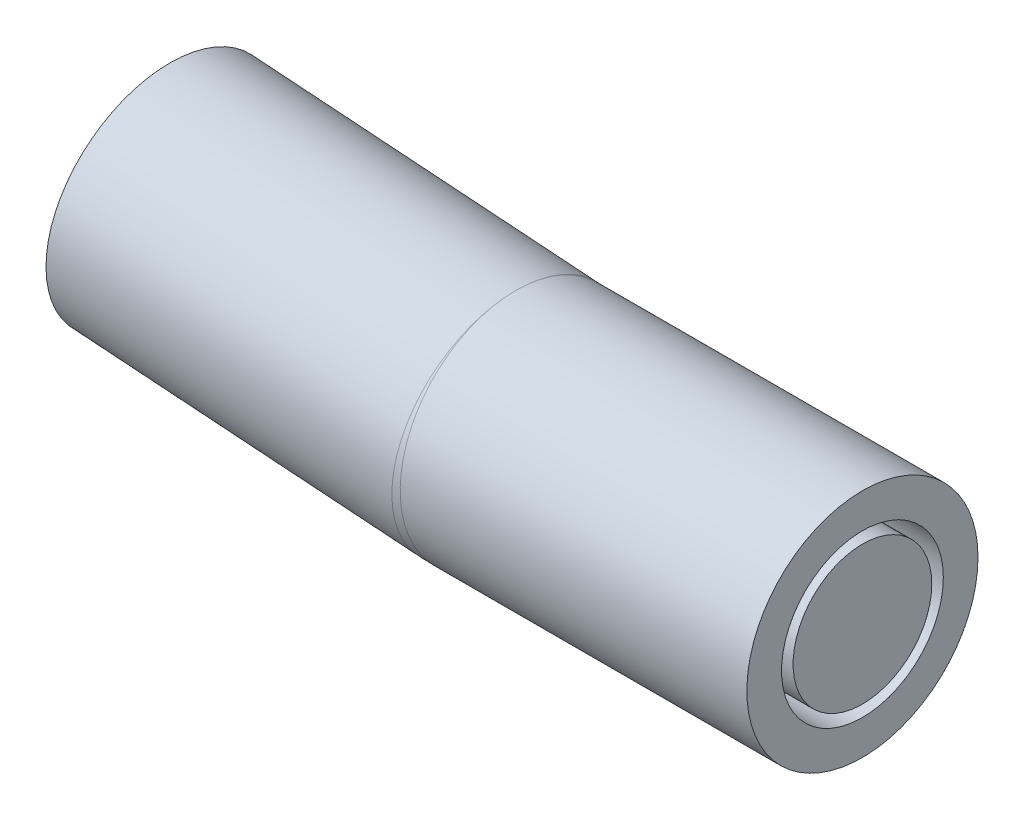
ISO-10303-21;
HEADER;
FILE_DESCRIPTION(('STEP AP214'),'2;1');
FILE_NAME('part.step','',(''),(''),'','','');
FILE_SCHEMA(('AUTOMOTIVE_DESIGN { 1 0 10303 214 1 1 1 1 }'));
ENDSEC;
DATA;
#1=APPLICATION_CONTEXT('core data for automotive mechanical design processes');
#2=APPLICATION_PROTOCOL_DEFINITION('international standard','automotive_design',2000,#1);
#3=PRODUCT_CONTEXT('',#1,'mechanical');
#4=PRODUCT('Part','Part','',(#3));
#5=PRODUCT_RELATED_PRODUCT_CATEGORY('part','',(#4));
#6=PRODUCT_DEFINITION_FORMATION('','',#4);
#7=PRODUCT_DEFINITION_CONTEXT('part definition',#1,'design');
#8=PRODUCT_DEFINITION('design','',#6,#7);
#9=PRODUCT_DEFINITION_SHAPE('','',#8);
#10=(LENGTH_UNIT() NAMED_UNIT(*) SI_UNIT(.MILLI.,.METRE.));
#11=(NAMED_UNIT(*) PLANE_ANGLE_UNIT() SI_UNIT($,.RADIAN.));
#12=(NAMED_UNIT(*) SI_UNIT($,.STERADIAN.) SOLID_ANGLE_UNIT());
#13=UNCERTAINTY_MEASURE_WITH_UNIT(LENGTH_MEASURE(1.E-05),#10,'distance_accuracy_value','');
#14=(GEOMETRIC_REPRESENTATION_CONTEXT(3) GLOBAL_UNCERTAINTY_ASSIGNED_CONTEXT((#13)) GLOBAL_UNIT_ASSIGNED_CONTEXT((#10,
#11,#12)) REPRESENTATION_CONTEXT('',''));
#15=CARTESIAN_POINT('',(0.,0.,0.));
#16=DIRECTION('',(0.,0.,1.));
#17=DIRECTION('',(1.,0.,0.));
#18=AXIS2_PLACEMENT_3D('',#15,#16,#17);
#19=CARTESIAN_POINT('',(30.,0.,0.));
#20=DIRECTION('',(-1.,0.,0.));
#21=DIRECTION('',(0.,0.,1.));
#22=AXIS2_PLACEMENT_3D('',#19,#20,#21);
#23=CYLINDRICAL_SURFACE('',#22,10.);
#24=CARTESIAN_POINT('',(30.,0.,0.));
#25=DIRECTION('',(1.,0.,0.));
#26=DIRECTION('',(0.,0.,-1.));
#27=AXIS2_PLACEMENT_3D('',#24,#25,#26);
#28=CIRCLE('',#27,10.);
#29=CARTESIAN_POINT('',(30.,0.,-10.));
#30=VERTEX_POINT('',#29);
#31=EDGE_CURVE('E11',#30,#30,#28,.T.);
#32=ORIENTED_EDGE('',*,*,#31,.F.);
#33=EDGE_LOOP('',(#32));
#34=FACE_BOUND('',#33,.T.);
#35=CARTESIAN_POINT('',(0.,0.,0.));
#36=DIRECTION('',(1.,0.,0.));
#37=DIRECTION('',(0.,0.,-1.));
#38=AXIS2_PLACEMENT_3D('',#35,#36,#37);
#39=CIRCLE('',#38,10.);
#40=CARTESIAN_POINT('',(0.,10.,0.));
#41=VERTEX_POINT('',#40);
#42=EDGE_CURVE('E47',#41,#41,#39,.T.);
#43=ORIENTED_EDGE('',*,*,#42,.T.);
#44=EDGE_LOOP('',(#43));
#45=FACE_BOUND('',#44,.T.);
#46=ADVANCED_FACE('F39',(#34,#45),#23,.T.);
#47=CARTESIAN_POINT('',(30.,0.,0.));
#48=DIRECTION('',(1.,0.,0.));
#49=DIRECTION('',(0.,0.,-1.));
#50=AXIS2_PLACEMENT_3D('',#47,#48,#49);
#51=PLANE('',#50);
#52=CARTESIAN_POINT('',(30.,0.,0.));
#53=DIRECTION('',(1.,0.,0.));
#54=DIRECTION('',(0.,0.,-1.));
#55=AXIS2_PLACEMENT_3D('',#52,#53,#54);
#56=CIRCLE('',#55,7.);
#57=CARTESIAN_POINT('',(30.,0.,-7.));
#58=VERTEX_POINT('',#57);
#59=EDGE_CURVE('E74',#58,#58,#56,.T.);
#60=ORIENTED_EDGE('',*,*,#59,.F.);
#61=EDGE_LOOP('',(#60));
#62=FACE_BOUND('',#61,.T.);
#63=ORIENTED_EDGE('',*,*,#31,.T.);
#64=EDGE_LOOP('',(#63));
#65=FACE_BOUND('',#64,.T.);
#66=ADVANCED_FACE('F98',(#62,#65),#51,.T.);
#67=CARTESIAN_POINT('',(2.,0.,0.));
#68=DIRECTION('',(1.,0.,0.));
#69=DIRECTION('',(0.,0.,-1.));
#70=AXIS2_PLACEMENT_3D('',#67,#68,#69);
#71=CYLINDRICAL_SURFACE('',#70,7.);
#72=CARTESIAN_POINT('',(2.,0.,0.));
#73=DIRECTION('',(1.,0.,0.));
#74=DIRECTION('',(0.,0.,-1.));
#75=AXIS2_PLACEMENT_3D('',#72,#73,#74);
#76=CIRCLE('',#75,7.);
#77=CARTESIAN_POINT('',(2.,0.,-7.));
#78=VERTEX_POINT('',#77);
#79=EDGE_CURVE('E76',#78,#78,#76,.T.);
#80=ORIENTED_EDGE('',*,*,#79,.F.);
#81=EDGE_LOOP('',(#80));
#82=FACE_BOUND('',#81,.T.);
#83=ORIENTED_EDGE('',*,*,#59,.T.);
#84=EDGE_LOOP('',(#83));
#85=FACE_BOUND('',#84,.T.);
#86=ADVANCED_FACE('F105',(#82,#85),#71,.F.);
#87=CARTESIAN_POINT('',(2.,0.,0.));
#88=DIRECTION('',(1.,0.,0.));
#89=DIRECTION('',(0.,0.,-1.));
#90=AXIS2_PLACEMENT_3D('',#87,#88,#89);
#91=PLANE('',#90);
#92=CARTESIAN_POINT('',(2.,0.,0.));
#93=DIRECTION('',(1.,0.,0.));
#94=DIRECTION('',(0.,0.,-1.));
#95=AXIS2_PLACEMENT_3D('',#92,#93,#94);
#96=CIRCLE('',#95,6.);
#97=CARTESIAN_POINT('',(2.,0.,-6.));
#98=VERTEX_POINT('',#97);
#99=EDGE_CURVE('E63',#98,#98,#96,.T.);
#100=ORIENTED_EDGE('',*,*,#99,.F.);
#101=EDGE_LOOP('',(#100));
#102=FACE_BOUND('',#101,.T.);
#103=ORIENTED_EDGE('',*,*,#79,.T.);
#104=EDGE_LOOP('',(#103));
#105=FACE_BOUND('',#104,.T.);
#106=ADVANCED_FACE('F112',(#102,#105),#91,.T.);
#107=CARTESIAN_POINT('',(2.,0.,0.));
#108=DIRECTION('',(1.,0.,0.));
#109=DIRECTION('',(0.,0.,-1.));
#110=AXIS2_PLACEMENT_3D('',#107,#108,#109);
#111=CYLINDRICAL_SURFACE('',#110,6.);
#112=ORIENTED_EDGE('',*,*,#99,.T.);
#113=EDGE_LOOP('',(#112));
#114=FACE_BOUND('',#113,.T.);
#115=CARTESIAN_POINT('',(30.,0.,0.));
#116=DIRECTION('',(1.,0.,0.));
#117=DIRECTION('',(0.,0.,-1.));
#118=AXIS2_PLACEMENT_3D('',#115,#116,#117);
#119=CIRCLE('',#118,6.);
#120=CARTESIAN_POINT('',(30.,0.,-6.));
#121=VERTEX_POINT('',#120);
#122=EDGE_CURVE('E57',#121,#121,#119,.T.);
#123=ORIENTED_EDGE('',*,*,#122,.F.);
#124=EDGE_LOOP('',(#123));
#125=FACE_BOUND('',#124,.T.);
#126=ADVANCED_FACE('F96',(#114,#125),#111,.T.);
#127=ORIENTED_EDGE('',*,*,#122,.T.);
#128=EDGE_LOOP('',(#127));
#129=FACE_BOUND('',#128,.T.);
#130=ADVANCED_FACE('F87',(#129),#51,.T.);
#131=CARTESIAN_POINT('',(-10.,10.,0.));
#132=DIRECTION('',(0.,-1.,0.));
#133=DIRECTION('',(-1.,0.,0.));
#134=AXIS2_PLACEMENT_3D('',#131,#132,#133);
#135=CIRCLE('',#134,10.);
#136=TRIMMED_CURVE('',#135,(PARAMETER_VALUE(-3.14159262026978)),
(PARAMETER_VALUE(3.14159262026978)),.T.,.PARAMETER.);
#137=CARTESIAN_POINT('',(0.,10.,0.));
#138=DIRECTION('',(0.,0.,-1.));
#139=AXIS1_PLACEMENT('',#137,#138);
#140=SURFACE_OF_REVOLUTION('',#136,#139);
#141=CARTESIAN_POINT('',(-0.69756473744125,0.0243594974017566,0.));
#142=DIRECTION('',(0.997564050259824,-0.069756473744125,0.));
#143=DIRECTION('',(0.069756473744125,0.997564050259824,0.));
#144=AXIS2_PLACEMENT_3D('',#141,#142,#143);
#145=CIRCLE('',#144,10.);
#146=EDGE_CURVE('E52',#41,#41,#145,.T.);
#147=ORIENTED_EDGE('',*,*,#146,.T.);
#148=ORIENTED_EDGE('',*,*,#42,.F.);
#149=EDGE_LOOP('',(#147,#148));
#150=FACE_BOUND('',#149,.T.);
#151=ADVANCED_FACE('F85',(#150),#140,.T.);
#152=CARTESIAN_POINT('',(-0.697564737441253,0.0243594974017568,0.));
#153=DIRECTION('',(0.997564050259824,-0.069756473744125,0.));
#154=DIRECTION('',(0.069756473744125,0.997564050259824,0.));
#155=AXIS2_PLACEMENT_3D('',#152,#153,#154);
#156=CYLINDRICAL_SURFACE('',#155,10.);
#157=CARTESIAN_POINT('',(-30.624486245236,2.11705370972551,0.));
#158=DIRECTION('',(0.997564050259824,-0.069756473744125,0.));
#159=DIRECTION('',(0.069756473744125,0.997564050259824,0.));
#160=AXIS2_PLACEMENT_3D('',#157,#158,#159);
#161=CIRCLE('',#160,10.);
#162=CARTESIAN_POINT('',(-29.9269215077947,12.0926942123238,0.));
#163=VERTEX_POINT('',#162);
#164=EDGE_CURVE('E58',#163,#163,#161,.T.);
#165=ORIENTED_EDGE('',*,*,#164,.T.);
#166=EDGE_LOOP('',(#165));
#167=FACE_BOUND('',#166,.T.);
#168=ORIENTED_EDGE('',*,*,#146,.F.);
#169=EDGE_LOOP('',(#168));
#170=FACE_BOUND('',#169,.T.);
#171=ADVANCED_FACE('F53',(#167,#170),#156,.T.);
#172=CARTESIAN_POINT('',(-30.624486245236,2.11705370972551,0.));
#173=DIRECTION('',(-0.997564050259824,0.069756473744125,0.));
#174=DIRECTION('',(-0.069756473744125,-0.997564050259824,0.));
#175=AXIS2_PLACEMENT_3D('',#172,#173,#174);
#176=PLANE('',#175);
#177=CARTESIAN_POINT('',(-30.6227870125951,2.1413538686159,0.));
#178=DIRECTION('',(-0.997564050259824,0.0697564737441251,0.));
#179=DIRECTION('',(-0.0697564737441251,-0.997564050259824,0.));
#180=AXIS2_PLACEMENT_3D('',#177,#178,#179);
#181=CIRCLE('',#180,7.);
#182=CARTESIAN_POINT('',(-31.1110823288039,-4.84159448320287,0.));
#183=VERTEX_POINT('',#182);
#184=EDGE_CURVE('E212',#183,#183,#181,.T.);
#185=ORIENTED_EDGE('',*,*,#184,.F.);
#186=EDGE_LOOP('',(#185));
#187=FACE_BOUND('',#186,.T.);
#188=ORIENTED_EDGE('',*,*,#164,.F.);
#189=EDGE_LOOP('',(#188));
#190=FACE_BOUND('',#189,.T.);
#191=ADVANCED_FACE('F93',(#187,#190),#176,.T.);
#192=CARTESIAN_POINT('',(-2.69099360531998,0.188172603780399,0.));
#193=DIRECTION('',(-0.997564050259824,0.0697564737441251,0.));
#194=DIRECTION('',(-0.0697564737441251,-0.997564050259824,0.));
#195=AXIS2_PLACEMENT_3D('',#192,#193,#194);
#196=CYLINDRICAL_SURFACE('',#195,7.);
#197=CARTESIAN_POINT('',(-2.69099360531998,0.188172603780399,0.));
#198=DIRECTION('',(-0.997564050259824,0.0697564737441251,0.));
#199=DIRECTION('',(-0.0697564737441251,-0.997564050259824,0.));
#200=AXIS2_PLACEMENT_3D('',#197,#198,#199);
#201=CIRCLE('',#200,7.);
#202=CARTESIAN_POINT('',(-3.17928892152886,-6.79477574803837,0.));
#203=VERTEX_POINT('',#202);
#204=EDGE_CURVE('E66',#203,#203,#201,.T.);
#205=ORIENTED_EDGE('',*,*,#204,.F.);
#206=EDGE_LOOP('',(#205));
#207=FACE_BOUND('',#206,.T.);
#208=ORIENTED_EDGE('',*,*,#184,.T.);
#209=EDGE_LOOP('',(#208));
#210=FACE_BOUND('',#209,.T.);
#211=ADVANCED_FACE('F161',(#207,#210),#196,.F.);
#212=CARTESIAN_POINT('',(-2.69099360531998,0.188172603780399,0.));
#213=DIRECTION('',(-0.997564050259824,0.0697564737441251,0.));
#214=DIRECTION('',(-0.0697564737441251,-0.997564050259824,0.));
#215=AXIS2_PLACEMENT_3D('',#212,#213,#214);
#216=PLANE('',#215);
#217=CARTESIAN_POINT('',(-2.69099360531998,0.188172603780399,0.));
#218=DIRECTION('',(-0.997564050259824,0.0697564737441251,0.));
#219=DIRECTION('',(-0.0697564737441251,-0.997564050259824,0.));
#220=AXIS2_PLACEMENT_3D('',#217,#218,#219);
#221=CIRCLE('',#220,6.);
#222=CARTESIAN_POINT('',(-3.10953244778473,-5.79721169777855,0.));
#223=VERTEX_POINT('',#222);
#224=EDGE_CURVE('E208',#223,#223,#221,.T.);
#225=ORIENTED_EDGE('',*,*,#224,.F.);
#226=EDGE_LOOP('',(#225));
#227=FACE_BOUND('',#226,.T.);
#228=ORIENTED_EDGE('',*,*,#204,.T.);
#229=EDGE_LOOP('',(#228));
#230=FACE_BOUND('',#229,.T.);
#231=ADVANCED_FACE('F172',(#227,#230),#216,.T.);
#232=CARTESIAN_POINT('',(-2.69099360531998,0.188172603780399,0.));
#233=DIRECTION('',(-0.997564050259824,0.0697564737441251,0.));
#234=DIRECTION('',(-0.0697564737441251,-0.997564050259824,0.));
#235=AXIS2_PLACEMENT_3D('',#232,#233,#234);
#236=CYLINDRICAL_SURFACE('',#235,6.);
#237=ORIENTED_EDGE('',*,*,#224,.T.);
#238=EDGE_LOOP('',(#237));
#239=FACE_BOUND('',#238,.T.);
#240=CARTESIAN_POINT('',(-30.6227870125951,2.1413538686159,0.));
#241=DIRECTION('',(-0.997564050259824,0.0697564737441251,0.));
#242=DIRECTION('',(-0.0697564737441251,-0.997564050259824,0.));
#243=AXIS2_PLACEMENT_3D('',#240,#241,#242);
#244=CIRCLE('',#243,6.);
#245=CARTESIAN_POINT('',(-31.0413258550598,-3.84403043294305,0.));
#246=VERTEX_POINT('',#245);
#247=EDGE_CURVE('E205',#246,#246,#244,.T.);
#248=ORIENTED_EDGE('',*,*,#247,.F.);
#249=EDGE_LOOP('',(#248));
#250=FACE_BOUND('',#249,.T.);
#251=ADVANCED_FACE('F182',(#239,#250),#236,.T.);
#252=ORIENTED_EDGE('',*,*,#247,.T.);
#253=EDGE_LOOP('',(#252));
#254=FACE_BOUND('',#253,.T.);
#255=ADVANCED_FACE('F164',(#254),#176,.T.);
#256=CLOSED_SHELL('',(#46,#66,#86,#106,#126,#130,#151,#171,#191,#211,#231,#251,#255));
#257=MANIFOLD_SOLID_BREP('B2',#256);
#258=ADVANCED_BREP_SHAPE_REPRESENTATION('',(#18,#257),#14);
#259=SHAPE_DEFINITION_REPRESENTATION(#9,#258);
ENDSEC;
END-ISO-10303-21;
